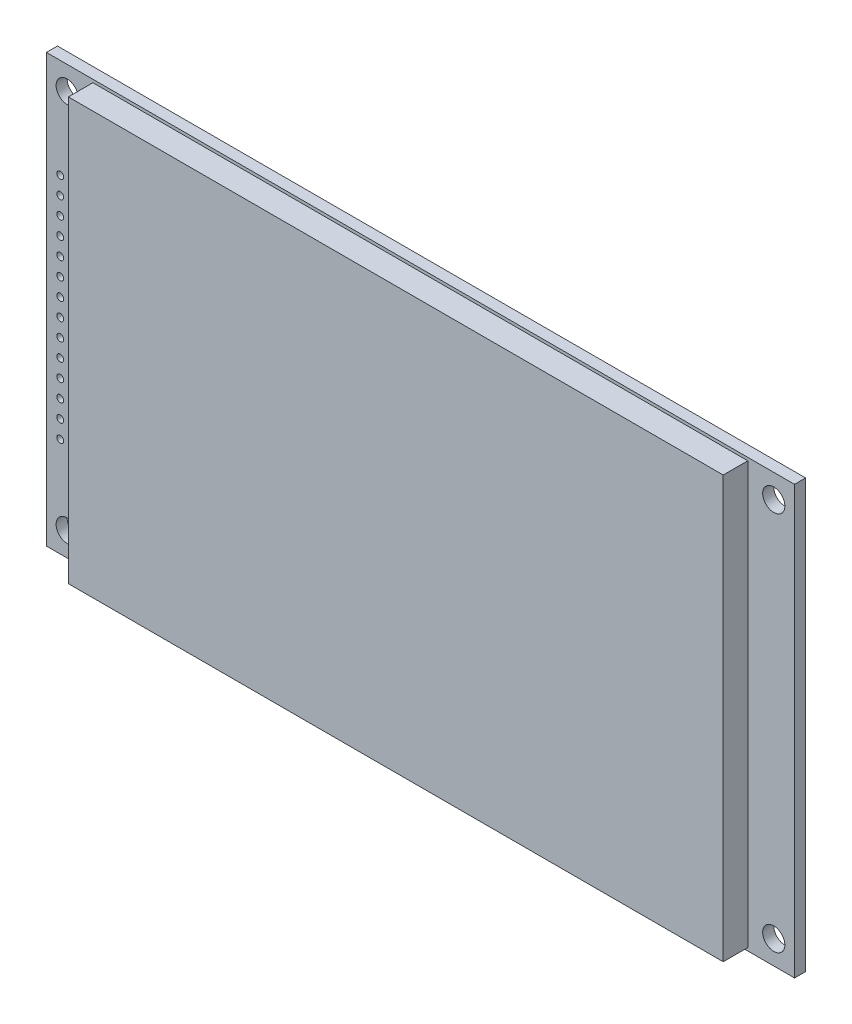
ISO-10303-21;
HEADER;
FILE_DESCRIPTION(('STEP AP214'),'2;1');
FILE_NAME('part.step','',(''),(''),'','','');
FILE_SCHEMA(('AUTOMOTIVE_DESIGN { 1 0 10303 214 1 1 1 1 }'));
ENDSEC;
DATA;
#1=APPLICATION_CONTEXT('core data for automotive mechanical design processes');
#2=APPLICATION_PROTOCOL_DEFINITION('international standard','automotive_design',2000,#1);
#3=PRODUCT_CONTEXT('',#1,'mechanical');
#4=PRODUCT('Part','Part','',(#3));
#5=PRODUCT_RELATED_PRODUCT_CATEGORY('part','',(#4));
#6=PRODUCT_DEFINITION_FORMATION('','',#4);
#7=PRODUCT_DEFINITION_CONTEXT('part definition',#1,'design');
#8=PRODUCT_DEFINITION('design','',#6,#7);
#9=PRODUCT_DEFINITION_SHAPE('','',#8);
#10=(LENGTH_UNIT() NAMED_UNIT(*) SI_UNIT(.MILLI.,.METRE.));
#11=(NAMED_UNIT(*) PLANE_ANGLE_UNIT() SI_UNIT($,.RADIAN.));
#12=(NAMED_UNIT(*) SI_UNIT($,.STERADIAN.) SOLID_ANGLE_UNIT());
#13=UNCERTAINTY_MEASURE_WITH_UNIT(LENGTH_MEASURE(1.E-05),#10,'distance_accuracy_value','');
#14=(GEOMETRIC_REPRESENTATION_CONTEXT(3) GLOBAL_UNCERTAINTY_ASSIGNED_CONTEXT((#13)) GLOBAL_UNIT_ASSIGNED_CONTEXT((#10,
#11,#12)) REPRESENTATION_CONTEXT('',''));
#15=CARTESIAN_POINT('',(0.,0.,0.));
#16=DIRECTION('',(0.,0.,1.));
#17=DIRECTION('',(1.,0.,0.));
#18=AXIS2_PLACEMENT_3D('',#15,#16,#17);
#19=CARTESIAN_POINT('',(0.,0.,1.6));
#20=DIRECTION('',(0.,0.,1.));
#21=DIRECTION('',(1.,0.,0.));
#22=AXIS2_PLACEMENT_3D('',#19,#20,#21);
#23=PLANE('',#22);
#24=CARTESIAN_POINT('',(-52.0200000000004,16.51,1.6));
#25=DIRECTION('',(0.,0.,1.));
#26=DIRECTION('',(1.,0.,0.));
#27=AXIS2_PLACEMENT_3D('',#24,#25,#26);
#28=CIRCLE('',#27,0.499999999999999);
#29=CARTESIAN_POINT('',(-51.5200000000004,16.51,1.6));
#30=VERTEX_POINT('',#29);
#31=EDGE_CURVE('E218',#30,#30,#28,.T.);
#32=ORIENTED_EDGE('',*,*,#31,.F.);
#33=EDGE_LOOP('',(#32));
#34=FACE_BOUND('',#33,.T.);
#35=CARTESIAN_POINT('',(-52.0200000000004,13.97,1.6));
#36=DIRECTION('',(0.,0.,1.));
#37=DIRECTION('',(1.,0.,0.));
#38=AXIS2_PLACEMENT_3D('',#35,#36,#37);
#39=CIRCLE('',#38,0.499999999999999);
#40=CARTESIAN_POINT('',(-51.5200000000004,13.97,1.6));
#41=VERTEX_POINT('',#40);
#42=EDGE_CURVE('E571',#41,#41,#39,.T.);
#43=ORIENTED_EDGE('',*,*,#42,.F.);
#44=EDGE_LOOP('',(#43));
#45=FACE_BOUND('',#44,.T.);
#46=CARTESIAN_POINT('',(-52.0200000000004,11.43,1.6));
#47=DIRECTION('',(0.,0.,1.));
#48=DIRECTION('',(1.,0.,0.));
#49=AXIS2_PLACEMENT_3D('',#46,#47,#48);
#50=CIRCLE('',#49,0.499999999999999);
#51=CARTESIAN_POINT('',(-51.5200000000004,11.43,1.6));
#52=VERTEX_POINT('',#51);
#53=EDGE_CURVE('E575',#52,#52,#50,.T.);
#54=ORIENTED_EDGE('',*,*,#53,.F.);
#55=EDGE_LOOP('',(#54));
#56=FACE_BOUND('',#55,.T.);
#57=CARTESIAN_POINT('',(-52.0200000000004,8.89,1.6));
#58=DIRECTION('',(0.,0.,1.));
#59=DIRECTION('',(1.,0.,0.));
#60=AXIS2_PLACEMENT_3D('',#57,#58,#59);
#61=CIRCLE('',#60,0.499999999999999);
#62=CARTESIAN_POINT('',(-51.5200000000004,8.89,1.6));
#63=VERTEX_POINT('',#62);
#64=EDGE_CURVE('E581',#63,#63,#61,.T.);
#65=ORIENTED_EDGE('',*,*,#64,.F.);
#66=EDGE_LOOP('',(#65));
#67=FACE_BOUND('',#66,.T.);
#68=CARTESIAN_POINT('',(-52.0200000000004,6.35,1.6));
#69=DIRECTION('',(0.,0.,1.));
#70=DIRECTION('',(1.,0.,0.));
#71=AXIS2_PLACEMENT_3D('',#68,#69,#70);
#72=CIRCLE('',#71,0.499999999999999);
#73=CARTESIAN_POINT('',(-51.5200000000004,6.35,1.6));
#74=VERTEX_POINT('',#73);
#75=EDGE_CURVE('E585',#74,#74,#72,.T.);
#76=ORIENTED_EDGE('',*,*,#75,.F.);
#77=EDGE_LOOP('',(#76));
#78=FACE_BOUND('',#77,.T.);
#79=CARTESIAN_POINT('',(-52.0200000000004,3.81,1.6));
#80=DIRECTION('',(0.,0.,1.));
#81=DIRECTION('',(1.,0.,0.));
#82=AXIS2_PLACEMENT_3D('',#79,#80,#81);
#83=CIRCLE('',#82,0.499999999999999);
#84=CARTESIAN_POINT('',(-51.5200000000004,3.81,1.6));
#85=VERTEX_POINT('',#84);
#86=EDGE_CURVE('E589',#85,#85,#83,.T.);
#87=ORIENTED_EDGE('',*,*,#86,.F.);
#88=EDGE_LOOP('',(#87));
#89=FACE_BOUND('',#88,.T.);
#90=CARTESIAN_POINT('',(-52.0200000000004,1.27,1.6));
#91=DIRECTION('',(0.,0.,1.));
#92=DIRECTION('',(1.,0.,0.));
#93=AXIS2_PLACEMENT_3D('',#90,#91,#92);
#94=CIRCLE('',#93,0.499999999999999);
#95=CARTESIAN_POINT('',(-51.5200000000004,1.27,1.6));
#96=VERTEX_POINT('',#95);
#97=EDGE_CURVE('E593',#96,#96,#94,.T.);
#98=ORIENTED_EDGE('',*,*,#97,.F.);
#99=EDGE_LOOP('',(#98));
#100=FACE_BOUND('',#99,.T.);
#101=CARTESIAN_POINT('',(-52.0200000000004,-1.27,1.6));
#102=DIRECTION('',(0.,0.,1.));
#103=DIRECTION('',(1.,0.,0.));
#104=AXIS2_PLACEMENT_3D('',#101,#102,#103);
#105=CIRCLE('',#104,0.499999999999999);
#106=CARTESIAN_POINT('',(-51.5200000000004,-1.27,1.6));
#107=VERTEX_POINT('',#106);
#108=EDGE_CURVE('E597',#107,#107,#105,.T.);
#109=ORIENTED_EDGE('',*,*,#108,.F.);
#110=EDGE_LOOP('',(#109));
#111=FACE_BOUND('',#110,.T.);
#112=CARTESIAN_POINT('',(-52.0200000000004,-3.81,1.6));
#113=DIRECTION('',(0.,0.,1.));
#114=DIRECTION('',(1.,0.,0.));
#115=AXIS2_PLACEMENT_3D('',#112,#113,#114);
#116=CIRCLE('',#115,0.499999999999999);
#117=CARTESIAN_POINT('',(-51.5200000000004,-3.81,1.6));
#118=VERTEX_POINT('',#117);
#119=EDGE_CURVE('E601',#118,#118,#116,.T.);
#120=ORIENTED_EDGE('',*,*,#119,.F.);
#121=EDGE_LOOP('',(#120));
#122=FACE_BOUND('',#121,.T.);
#123=CARTESIAN_POINT('',(-52.0200000000004,-6.35,1.6));
#124=DIRECTION('',(0.,0.,1.));
#125=DIRECTION('',(1.,0.,0.));
#126=AXIS2_PLACEMENT_3D('',#123,#124,#125);
#127=CIRCLE('',#126,0.499999999999999);
#128=CARTESIAN_POINT('',(-51.5200000000004,-6.35,1.6));
#129=VERTEX_POINT('',#128);
#130=EDGE_CURVE('E605',#129,#129,#127,.T.);
#131=ORIENTED_EDGE('',*,*,#130,.F.);
#132=EDGE_LOOP('',(#131));
#133=FACE_BOUND('',#132,.T.);
#134=CARTESIAN_POINT('',(-52.0200000000004,-8.89000000000001,1.6));
#135=DIRECTION('',(0.,0.,1.));
#136=DIRECTION('',(1.,0.,0.));
#137=AXIS2_PLACEMENT_3D('',#134,#135,#136);
#138=CIRCLE('',#137,0.499999999999999);
#139=CARTESIAN_POINT('',(-51.5200000000004,-8.89000000000001,1.6));
#140=VERTEX_POINT('',#139);
#141=EDGE_CURVE('E609',#140,#140,#138,.T.);
#142=ORIENTED_EDGE('',*,*,#141,.F.);
#143=EDGE_LOOP('',(#142));
#144=FACE_BOUND('',#143,.T.);
#145=CARTESIAN_POINT('',(-52.0200000000004,-11.43,1.6));
#146=DIRECTION('',(0.,0.,1.));
#147=DIRECTION('',(1.,0.,0.));
#148=AXIS2_PLACEMENT_3D('',#145,#146,#147);
#149=CIRCLE('',#148,0.499999999999999);
#150=CARTESIAN_POINT('',(-51.5200000000004,-11.43,1.6));
#151=VERTEX_POINT('',#150);
#152=EDGE_CURVE('E613',#151,#151,#149,.T.);
#153=ORIENTED_EDGE('',*,*,#152,.F.);
#154=EDGE_LOOP('',(#153));
#155=FACE_BOUND('',#154,.T.);
#156=CARTESIAN_POINT('',(-52.0200000000004,-13.97,1.6));
#157=DIRECTION('',(0.,0.,1.));
#158=DIRECTION('',(1.,0.,0.));
#159=AXIS2_PLACEMENT_3D('',#156,#157,#158);
#160=CIRCLE('',#159,0.499999999999999);
#161=CARTESIAN_POINT('',(-51.5200000000004,-13.97,1.6));
#162=VERTEX_POINT('',#161);
#163=EDGE_CURVE('E617',#162,#162,#160,.T.);
#164=ORIENTED_EDGE('',*,*,#163,.F.);
#165=EDGE_LOOP('',(#164));
#166=FACE_BOUND('',#165,.T.);
#167=CARTESIAN_POINT('',(-52.0200000000004,-16.51,1.6));
#168=DIRECTION('',(0.,0.,1.));
#169=DIRECTION('',(1.,0.,0.));
#170=AXIS2_PLACEMENT_3D('',#167,#168,#169);
#171=CIRCLE('',#170,0.499999999999999);
#172=CARTESIAN_POINT('',(-51.5200000000004,-16.51,1.6));
#173=VERTEX_POINT('',#172);
#174=EDGE_CURVE('E621',#173,#173,#171,.T.);
#175=ORIENTED_EDGE('',*,*,#174,.F.);
#176=EDGE_LOOP('',(#175));
#177=FACE_BOUND('',#176,.T.);
#178=DIRECTION('',(0.,1.,0.));
#179=VECTOR('',#178,1.);
#180=CARTESIAN_POINT('',(47.2699999999995,30.44,1.6));
#181=LINE('',#180,#179);
#182=CARTESIAN_POINT('',(47.2699999999995,-30.44,1.6));
#183=VERTEX_POINT('',#182);
#184=CARTESIAN_POINT('',(47.2699999999995,30.44,1.6));
#185=VERTEX_POINT('',#184);
#186=EDGE_CURVE('E65',#183,#185,#181,.T.);
#187=ORIENTED_EDGE('',*,*,#186,.F.);
#188=DIRECTION('',(1.,0.,0.));
#189=VECTOR('',#188,1.);
#190=CARTESIAN_POINT('',(47.2699999999995,-30.44,1.6));
#191=LINE('',#190,#189);
#192=CARTESIAN_POINT('',(-47.3000000000004,-30.44,1.6));
#193=VERTEX_POINT('',#192);
#194=EDGE_CURVE('E69',#193,#183,#191,.T.);
#195=ORIENTED_EDGE('',*,*,#194,.F.);
#196=DIRECTION('',(0.,-1.,0.));
#197=VECTOR('',#196,1.);
#198=CARTESIAN_POINT('',(-47.3000000000004,30.44,1.6));
#199=LINE('',#198,#197);
#200=CARTESIAN_POINT('',(-47.3000000000004,30.44,1.6));
#201=VERTEX_POINT('',#200);
#202=EDGE_CURVE('E274',#201,#193,#199,.T.);
#203=ORIENTED_EDGE('',*,*,#202,.F.);
#204=DIRECTION('',(-1.,0.,0.));
#205=VECTOR('',#204,1.);
#206=CARTESIAN_POINT('',(47.2699999999995,30.44,1.6));
#207=LINE('',#206,#205);
#208=EDGE_CURVE('E271',#185,#201,#207,.T.);
#209=ORIENTED_EDGE('',*,*,#208,.F.);
#210=EDGE_LOOP('',(#187,#195,#203,#209));
#211=FACE_BOUND('',#210,.T.);
#212=CARTESIAN_POINT('',(51.02,-27.45,1.6));
#213=DIRECTION('',(0.,0.,1.));
#214=DIRECTION('',(1.,0.,0.));
#215=AXIS2_PLACEMENT_3D('',#212,#213,#214);
#216=CIRCLE('',#215,1.6);
#217=CARTESIAN_POINT('',(52.62,-27.45,1.6));
#218=VERTEX_POINT('',#217);
#219=EDGE_CURVE('E153',#218,#218,#216,.T.);
#220=ORIENTED_EDGE('',*,*,#219,.F.);
#221=EDGE_LOOP('',(#220));
#222=FACE_BOUND('',#221,.T.);
#223=CARTESIAN_POINT('',(-51.02,27.45,1.6));
#224=DIRECTION('',(0.,0.,1.));
#225=DIRECTION('',(1.,0.,0.));
#226=AXIS2_PLACEMENT_3D('',#223,#224,#225);
#227=CIRCLE('',#226,1.6);
#228=CARTESIAN_POINT('',(-49.42,27.45,1.6));
#229=VERTEX_POINT('',#228);
#230=EDGE_CURVE('E169',#229,#229,#227,.T.);
#231=ORIENTED_EDGE('',*,*,#230,.F.);
#232=EDGE_LOOP('',(#231));
#233=FACE_BOUND('',#232,.T.);
#234=DIRECTION('',(0.,1.,0.));
#235=VECTOR('',#234,1.);
#236=CARTESIAN_POINT('',(54.0199999999995,30.87,1.6));
#237=LINE('',#236,#235);
#238=CARTESIAN_POINT('',(54.0199999999995,-30.87,1.6));
#239=VERTEX_POINT('',#238);
#240=CARTESIAN_POINT('',(54.0199999999995,30.87,1.6));
#241=VERTEX_POINT('',#240);
#242=EDGE_CURVE('E177',#239,#241,#237,.T.);
#243=ORIENTED_EDGE('',*,*,#242,.T.);
#244=DIRECTION('',(-1.,0.,0.));
#245=VECTOR('',#244,1.);
#246=CARTESIAN_POINT('',(-54.0200000000004,30.87,1.6));
#247=LINE('',#246,#245);
#248=CARTESIAN_POINT('',(-54.0200000000004,30.87,1.6));
#249=VERTEX_POINT('',#248);
#250=EDGE_CURVE('E181',#241,#249,#247,.T.);
#251=ORIENTED_EDGE('',*,*,#250,.T.);
#252=DIRECTION('',(0.,-1.,0.));
#253=VECTOR('',#252,1.);
#254=CARTESIAN_POINT('',(-54.0200000000004,30.87,1.6));
#255=LINE('',#254,#253);
#256=CARTESIAN_POINT('',(-54.0200000000004,-30.87,1.6));
#257=VERTEX_POINT('',#256);
#258=EDGE_CURVE('E185',#249,#257,#255,.T.);
#259=ORIENTED_EDGE('',*,*,#258,.T.);
#260=DIRECTION('',(1.,0.,0.));
#261=VECTOR('',#260,1.);
#262=CARTESIAN_POINT('',(-54.0200000000004,-30.87,1.6));
#263=LINE('',#262,#261);
#264=EDGE_CURVE('E188',#257,#239,#263,.T.);
#265=ORIENTED_EDGE('',*,*,#264,.T.);
#266=EDGE_LOOP('',(#243,#251,#259,#265));
#267=FACE_BOUND('',#266,.T.);
#268=CARTESIAN_POINT('',(-51.0199999999996,-27.45,1.6));
#269=DIRECTION('',(0.,0.,1.));
#270=DIRECTION('',(1.,0.,0.));
#271=AXIS2_PLACEMENT_3D('',#268,#269,#270);
#272=CIRCLE('',#271,1.6);
#273=CARTESIAN_POINT('',(-49.4199999999996,-27.45,1.6));
#274=VERTEX_POINT('',#273);
#275=EDGE_CURVE('E161',#274,#274,#272,.T.);
#276=ORIENTED_EDGE('',*,*,#275,.F.);
#277=EDGE_LOOP('',(#276));
#278=FACE_BOUND('',#277,.T.);
#279=CARTESIAN_POINT('',(51.02,27.45,1.6));
#280=DIRECTION('',(0.,0.,1.));
#281=DIRECTION('',(1.,0.,0.));
#282=AXIS2_PLACEMENT_3D('',#279,#280,#281);
#283=CIRCLE('',#282,1.6);
#284=CARTESIAN_POINT('',(52.62,27.45,1.6));
#285=VERTEX_POINT('',#284);
#286=EDGE_CURVE('E143',#285,#285,#283,.T.);
#287=ORIENTED_EDGE('',*,*,#286,.F.);
#288=EDGE_LOOP('',(#287));
#289=FACE_BOUND('',#288,.T.);
#290=ADVANCED_FACE('F47',(#34,#45,#56,#67,#78,#89,#100,#111,#122,#133,#144,#155,#166,#177,#211,
#222,#233,#267,#278,#289),#23,.T.);
#291=CARTESIAN_POINT('',(0.,0.,0.));
#292=DIRECTION('',(0.,0.,1.));
#293=DIRECTION('',(1.,0.,0.));
#294=AXIS2_PLACEMENT_3D('',#291,#292,#293);
#295=PLANE('',#294);
#296=CARTESIAN_POINT('',(-52.0200000000004,16.51,0.));
#297=DIRECTION('',(0.,0.,1.));
#298=DIRECTION('',(1.,0.,0.));
#299=AXIS2_PLACEMENT_3D('',#296,#297,#298);
#300=CIRCLE('',#299,0.499999999999999);
#301=CARTESIAN_POINT('',(-51.5200000000004,16.51,0.));
#302=VERTEX_POINT('',#301);
#303=EDGE_CURVE('E51',#302,#302,#300,.T.);
#304=ORIENTED_EDGE('',*,*,#303,.T.);
#305=EDGE_LOOP('',(#304));
#306=FACE_BOUND('',#305,.T.);
#307=CARTESIAN_POINT('',(-52.0200000000004,13.97,0.));
#308=DIRECTION('',(0.,0.,1.));
#309=DIRECTION('',(1.,0.,0.));
#310=AXIS2_PLACEMENT_3D('',#307,#308,#309);
#311=CIRCLE('',#310,0.499999999999999);
#312=CARTESIAN_POINT('',(-51.5200000000004,13.97,0.));
#313=VERTEX_POINT('',#312);
#314=EDGE_CURVE('E261',#313,#313,#311,.T.);
#315=ORIENTED_EDGE('',*,*,#314,.T.);
#316=EDGE_LOOP('',(#315));
#317=FACE_BOUND('',#316,.T.);
#318=CARTESIAN_POINT('',(-52.0200000000004,11.43,0.));
#319=DIRECTION('',(0.,0.,1.));
#320=DIRECTION('',(1.,0.,0.));
#321=AXIS2_PLACEMENT_3D('',#318,#319,#320);
#322=CIRCLE('',#321,0.499999999999999);
#323=CARTESIAN_POINT('',(-51.5200000000004,11.43,0.));
#324=VERTEX_POINT('',#323);
#325=EDGE_CURVE('E258',#324,#324,#322,.T.);
#326=ORIENTED_EDGE('',*,*,#325,.T.);
#327=EDGE_LOOP('',(#326));
#328=FACE_BOUND('',#327,.T.);
#329=CARTESIAN_POINT('',(-52.0200000000004,8.89,0.));
#330=DIRECTION('',(0.,0.,1.));
#331=DIRECTION('',(1.,0.,0.));
#332=AXIS2_PLACEMENT_3D('',#329,#330,#331);
#333=CIRCLE('',#332,0.499999999999999);
#334=CARTESIAN_POINT('',(-51.5200000000004,8.89,0.));
#335=VERTEX_POINT('',#334);
#336=EDGE_CURVE('E254',#335,#335,#333,.T.);
#337=ORIENTED_EDGE('',*,*,#336,.T.);
#338=EDGE_LOOP('',(#337));
#339=FACE_BOUND('',#338,.T.);
#340=CARTESIAN_POINT('',(-52.0200000000004,6.35,0.));
#341=DIRECTION('',(0.,0.,1.));
#342=DIRECTION('',(1.,0.,0.));
#343=AXIS2_PLACEMENT_3D('',#340,#341,#342);
#344=CIRCLE('',#343,0.499999999999999);
#345=CARTESIAN_POINT('',(-51.5200000000004,6.35,0.));
#346=VERTEX_POINT('',#345);
#347=EDGE_CURVE('E250',#346,#346,#344,.T.);
#348=ORIENTED_EDGE('',*,*,#347,.T.);
#349=EDGE_LOOP('',(#348));
#350=FACE_BOUND('',#349,.T.);
#351=CARTESIAN_POINT('',(-52.0200000000004,3.81,0.));
#352=DIRECTION('',(0.,0.,1.));
#353=DIRECTION('',(1.,0.,0.));
#354=AXIS2_PLACEMENT_3D('',#351,#352,#353);
#355=CIRCLE('',#354,0.499999999999999);
#356=CARTESIAN_POINT('',(-51.5200000000004,3.81,0.));
#357=VERTEX_POINT('',#356);
#358=EDGE_CURVE('E246',#357,#357,#355,.T.);
#359=ORIENTED_EDGE('',*,*,#358,.T.);
#360=EDGE_LOOP('',(#359));
#361=FACE_BOUND('',#360,.T.);
#362=CARTESIAN_POINT('',(-52.0200000000004,1.27,0.));
#363=DIRECTION('',(0.,0.,1.));
#364=DIRECTION('',(1.,0.,0.));
#365=AXIS2_PLACEMENT_3D('',#362,#363,#364);
#366=CIRCLE('',#365,0.499999999999999);
#367=CARTESIAN_POINT('',(-51.5200000000004,1.27,0.));
#368=VERTEX_POINT('',#367);
#369=EDGE_CURVE('E242',#368,#368,#366,.T.);
#370=ORIENTED_EDGE('',*,*,#369,.T.);
#371=EDGE_LOOP('',(#370));
#372=FACE_BOUND('',#371,.T.);
#373=CARTESIAN_POINT('',(-52.0200000000004,-1.27,0.));
#374=DIRECTION('',(0.,0.,1.));
#375=DIRECTION('',(1.,0.,0.));
#376=AXIS2_PLACEMENT_3D('',#373,#374,#375);
#377=CIRCLE('',#376,0.499999999999999);
#378=CARTESIAN_POINT('',(-51.5200000000004,-1.27,0.));
#379=VERTEX_POINT('',#378);
#380=EDGE_CURVE('E238',#379,#379,#377,.T.);
#381=ORIENTED_EDGE('',*,*,#380,.T.);
#382=EDGE_LOOP('',(#381));
#383=FACE_BOUND('',#382,.T.);
#384=CARTESIAN_POINT('',(-52.0200000000004,-3.81,0.));
#385=DIRECTION('',(0.,0.,1.));
#386=DIRECTION('',(1.,0.,0.));
#387=AXIS2_PLACEMENT_3D('',#384,#385,#386);
#388=CIRCLE('',#387,0.499999999999999);
#389=CARTESIAN_POINT('',(-51.5200000000004,-3.81,0.));
#390=VERTEX_POINT('',#389);
#391=EDGE_CURVE('E234',#390,#390,#388,.T.);
#392=ORIENTED_EDGE('',*,*,#391,.T.);
#393=EDGE_LOOP('',(#392));
#394=FACE_BOUND('',#393,.T.);
#395=CARTESIAN_POINT('',(-52.0200000000004,-6.35,0.));
#396=DIRECTION('',(0.,0.,1.));
#397=DIRECTION('',(1.,0.,0.));
#398=AXIS2_PLACEMENT_3D('',#395,#396,#397);
#399=CIRCLE('',#398,0.499999999999999);
#400=CARTESIAN_POINT('',(-51.5200000000004,-6.35,0.));
#401=VERTEX_POINT('',#400);
#402=EDGE_CURVE('E230',#401,#401,#399,.T.);
#403=ORIENTED_EDGE('',*,*,#402,.T.);
#404=EDGE_LOOP('',(#403));
#405=FACE_BOUND('',#404,.T.);
#406=CARTESIAN_POINT('',(-52.0200000000004,-8.89000000000001,0.));
#407=DIRECTION('',(0.,0.,1.));
#408=DIRECTION('',(1.,0.,0.));
#409=AXIS2_PLACEMENT_3D('',#406,#407,#408);
#410=CIRCLE('',#409,0.499999999999999);
#411=CARTESIAN_POINT('',(-51.5200000000004,-8.89000000000001,0.));
#412=VERTEX_POINT('',#411);
#413=EDGE_CURVE('E226',#412,#412,#410,.T.);
#414=ORIENTED_EDGE('',*,*,#413,.T.);
#415=EDGE_LOOP('',(#414));
#416=FACE_BOUND('',#415,.T.);
#417=CARTESIAN_POINT('',(-52.0200000000004,-11.43,0.));
#418=DIRECTION('',(0.,0.,1.));
#419=DIRECTION('',(1.,0.,0.));
#420=AXIS2_PLACEMENT_3D('',#417,#418,#419);
#421=CIRCLE('',#420,0.499999999999999);
#422=CARTESIAN_POINT('',(-51.5200000000004,-11.43,0.));
#423=VERTEX_POINT('',#422);
#424=EDGE_CURVE('E222',#423,#423,#421,.T.);
#425=ORIENTED_EDGE('',*,*,#424,.T.);
#426=EDGE_LOOP('',(#425));
#427=FACE_BOUND('',#426,.T.);
#428=CARTESIAN_POINT('',(-52.0200000000004,-13.97,0.));
#429=DIRECTION('',(0.,0.,1.));
#430=DIRECTION('',(1.,0.,0.));
#431=AXIS2_PLACEMENT_3D('',#428,#429,#430);
#432=CIRCLE('',#431,0.499999999999999);
#433=CARTESIAN_POINT('',(-51.5200000000004,-13.97,0.));
#434=VERTEX_POINT('',#433);
#435=EDGE_CURVE('E217',#434,#434,#432,.T.);
#436=ORIENTED_EDGE('',*,*,#435,.T.);
#437=EDGE_LOOP('',(#436));
#438=FACE_BOUND('',#437,.T.);
#439=CARTESIAN_POINT('',(-52.0200000000004,-16.51,0.));
#440=DIRECTION('',(0.,0.,1.));
#441=DIRECTION('',(1.,0.,0.));
#442=AXIS2_PLACEMENT_3D('',#439,#440,#441);
#443=CIRCLE('',#442,0.499999999999999);
#444=CARTESIAN_POINT('',(-51.5200000000004,-16.51,0.));
#445=VERTEX_POINT('',#444);
#446=EDGE_CURVE('E213',#445,#445,#443,.T.);
#447=ORIENTED_EDGE('',*,*,#446,.T.);
#448=EDGE_LOOP('',(#447));
#449=FACE_BOUND('',#448,.T.);
#450=DIRECTION('',(0.,1.,0.));
#451=VECTOR('',#450,1.);
#452=CARTESIAN_POINT('',(54.0199999999995,30.87,0.));
#453=LINE('',#452,#451);
#454=CARTESIAN_POINT('',(54.0199999999995,-30.87,0.));
#455=VERTEX_POINT('',#454);
#456=CARTESIAN_POINT('',(54.0199999999995,30.87,0.));
#457=VERTEX_POINT('',#456);
#458=EDGE_CURVE('E173',#455,#457,#453,.T.);
#459=ORIENTED_EDGE('',*,*,#458,.F.);
#460=DIRECTION('',(1.,0.,0.));
#461=VECTOR('',#460,1.);
#462=CARTESIAN_POINT('',(-54.0200000000004,-30.87,0.));
#463=LINE('',#462,#461);
#464=CARTESIAN_POINT('',(-54.0200000000004,-30.87,0.));
#465=VERTEX_POINT('',#464);
#466=EDGE_CURVE('E182',#465,#455,#463,.T.);
#467=ORIENTED_EDGE('',*,*,#466,.F.);
#468=DIRECTION('',(0.,-1.,0.));
#469=VECTOR('',#468,1.);
#470=CARTESIAN_POINT('',(-54.0200000000004,30.87,0.));
#471=LINE('',#470,#469);
#472=CARTESIAN_POINT('',(-54.0200000000004,30.87,0.));
#473=VERTEX_POINT('',#472);
#474=EDGE_CURVE('E198',#473,#465,#471,.T.);
#475=ORIENTED_EDGE('',*,*,#474,.F.);
#476=DIRECTION('',(-1.,0.,0.));
#477=VECTOR('',#476,1.);
#478=CARTESIAN_POINT('',(-54.0200000000004,30.87,0.));
#479=LINE('',#478,#477);
#480=EDGE_CURVE('E195',#457,#473,#479,.T.);
#481=ORIENTED_EDGE('',*,*,#480,.F.);
#482=EDGE_LOOP('',(#459,#467,#475,#481));
#483=FACE_BOUND('',#482,.T.);
#484=CARTESIAN_POINT('',(-51.02,27.45,0.));
#485=DIRECTION('',(0.,0.,1.));
#486=DIRECTION('',(1.,0.,0.));
#487=AXIS2_PLACEMENT_3D('',#484,#485,#486);
#488=CIRCLE('',#487,1.6);
#489=CARTESIAN_POINT('',(-49.42,27.45,0.));
#490=VERTEX_POINT('',#489);
#491=EDGE_CURVE('E165',#490,#490,#488,.T.);
#492=ORIENTED_EDGE('',*,*,#491,.T.);
#493=EDGE_LOOP('',(#492));
#494=FACE_BOUND('',#493,.T.);
#495=CARTESIAN_POINT('',(-51.0199999999996,-27.45,0.));
#496=DIRECTION('',(0.,0.,1.));
#497=DIRECTION('',(1.,0.,0.));
#498=AXIS2_PLACEMENT_3D('',#495,#496,#497);
#499=CIRCLE('',#498,1.6);
#500=CARTESIAN_POINT('',(-49.4199999999996,-27.45,0.));
#501=VERTEX_POINT('',#500);
#502=EDGE_CURVE('E157',#501,#501,#499,.T.);
#503=ORIENTED_EDGE('',*,*,#502,.T.);
#504=EDGE_LOOP('',(#503));
#505=FACE_BOUND('',#504,.T.);
#506=CARTESIAN_POINT('',(51.02,-27.45,0.));
#507=DIRECTION('',(0.,0.,1.));
#508=DIRECTION('',(1.,0.,0.));
#509=AXIS2_PLACEMENT_3D('',#506,#507,#508);
#510=CIRCLE('',#509,1.6);
#511=CARTESIAN_POINT('',(52.62,-27.45,0.));
#512=VERTEX_POINT('',#511);
#513=EDGE_CURVE('E151',#512,#512,#510,.T.);
#514=ORIENTED_EDGE('',*,*,#513,.T.);
#515=EDGE_LOOP('',(#514));
#516=FACE_BOUND('',#515,.T.);
#517=CARTESIAN_POINT('',(51.02,27.45,0.));
#518=DIRECTION('',(0.,0.,1.));
#519=DIRECTION('',(1.,0.,0.));
#520=AXIS2_PLACEMENT_3D('',#517,#518,#519);
#521=CIRCLE('',#520,1.6);
#522=CARTESIAN_POINT('',(52.62,27.45,0.));
#523=VERTEX_POINT('',#522);
#524=EDGE_CURVE('E138',#523,#523,#521,.T.);
#525=ORIENTED_EDGE('',*,*,#524,.T.);
#526=EDGE_LOOP('',(#525));
#527=FACE_BOUND('',#526,.T.);
#528=ADVANCED_FACE('F294',(#306,#317,#328,#339,#350,#361,#372,#383,#394,#405,#416,#427,#438,
#449,#483,#494,#505,#516,#527),#295,.F.);
#529=CARTESIAN_POINT('',(54.0199999999995,30.87,1.6));
#530=DIRECTION('',(-1.,0.,0.));
#531=DIRECTION('',(0.,0.,1.));
#532=AXIS2_PLACEMENT_3D('',#529,#530,#531);
#533=PLANE('',#532);
#534=ORIENTED_EDGE('',*,*,#458,.T.);
#535=DIRECTION('',(0.,0.,-1.));
#536=VECTOR('',#535,1.);
#537=CARTESIAN_POINT('',(54.0199999999995,30.87,1.6));
#538=LINE('',#537,#536);
#539=EDGE_CURVE('E11',#241,#457,#538,.T.);
#540=ORIENTED_EDGE('',*,*,#539,.F.);
#541=ORIENTED_EDGE('',*,*,#242,.F.);
#542=DIRECTION('',(0.,0.,-1.));
#543=VECTOR('',#542,1.);
#544=CARTESIAN_POINT('',(54.0199999999995,-30.87,1.6));
#545=LINE('',#544,#543);
#546=EDGE_CURVE('E191',#239,#455,#545,.T.);
#547=ORIENTED_EDGE('',*,*,#546,.T.);
#548=EDGE_LOOP('',(#534,#540,#541,#547));
#549=FACE_BOUND('',#548,.T.);
#550=ADVANCED_FACE('F49',(#549),#533,.F.);
#551=CARTESIAN_POINT('',(-54.0200000000004,30.87,1.6));
#552=DIRECTION('',(0.,-1.,0.));
#553=DIRECTION('',(0.,0.,-1.));
#554=AXIS2_PLACEMENT_3D('',#551,#552,#553);
#555=PLANE('',#554);
#556=ORIENTED_EDGE('',*,*,#480,.T.);
#557=DIRECTION('',(0.,0.,-1.));
#558=VECTOR('',#557,1.);
#559=CARTESIAN_POINT('',(-54.0200000000004,30.87,1.6));
#560=LINE('',#559,#558);
#561=EDGE_CURVE('E57',#249,#473,#560,.T.);
#562=ORIENTED_EDGE('',*,*,#561,.F.);
#563=ORIENTED_EDGE('',*,*,#250,.F.);
#564=ORIENTED_EDGE('',*,*,#539,.T.);
#565=EDGE_LOOP('',(#556,#562,#563,#564));
#566=FACE_BOUND('',#565,.T.);
#567=ADVANCED_FACE('F320',(#566),#555,.F.);
#568=CARTESIAN_POINT('',(-54.0200000000004,30.87,1.6));
#569=DIRECTION('',(1.,0.,0.));
#570=DIRECTION('',(0.,0.,-1.));
#571=AXIS2_PLACEMENT_3D('',#568,#569,#570);
#572=PLANE('',#571);
#573=ORIENTED_EDGE('',*,*,#474,.T.);
#574=DIRECTION('',(0.,0.,-1.));
#575=VECTOR('',#574,1.);
#576=CARTESIAN_POINT('',(-54.0200000000004,-30.87,1.6));
#577=LINE('',#576,#575);
#578=EDGE_CURVE('E206',#257,#465,#577,.T.);
#579=ORIENTED_EDGE('',*,*,#578,.F.);
#580=ORIENTED_EDGE('',*,*,#258,.F.);
#581=ORIENTED_EDGE('',*,*,#561,.T.);
#582=EDGE_LOOP('',(#573,#579,#580,#581));
#583=FACE_BOUND('',#582,.T.);
#584=ADVANCED_FACE('F328',(#583),#572,.F.);
#585=CARTESIAN_POINT('',(-54.0200000000004,-30.87,1.6));
#586=DIRECTION('',(0.,1.,0.));
#587=DIRECTION('',(0.,0.,1.));
#588=AXIS2_PLACEMENT_3D('',#585,#586,#587);
#589=PLANE('',#588);
#590=ORIENTED_EDGE('',*,*,#466,.T.);
#591=ORIENTED_EDGE('',*,*,#546,.F.);
#592=ORIENTED_EDGE('',*,*,#264,.F.);
#593=ORIENTED_EDGE('',*,*,#578,.T.);
#594=EDGE_LOOP('',(#590,#591,#592,#593));
#595=FACE_BOUND('',#594,.T.);
#596=ADVANCED_FACE('F324',(#595),#589,.F.);
#597=CARTESIAN_POINT('',(-51.02,27.45,1.6));
#598=DIRECTION('',(0.,0.,-1.));
#599=DIRECTION('',(-1.,0.,0.));
#600=AXIS2_PLACEMENT_3D('',#597,#598,#599);
#601=CYLINDRICAL_SURFACE('',#600,1.6);
#602=ORIENTED_EDGE('',*,*,#230,.T.);
#603=EDGE_LOOP('',(#602));
#604=FACE_BOUND('',#603,.T.);
#605=ORIENTED_EDGE('',*,*,#491,.F.);
#606=EDGE_LOOP('',(#605));
#607=FACE_BOUND('',#606,.T.);
#608=ADVANCED_FACE('F327',(#604,#607),#601,.F.);
#609=CARTESIAN_POINT('',(-51.0199999999996,-27.45,1.6));
#610=DIRECTION('',(0.,0.,-1.));
#611=DIRECTION('',(-1.,0.,0.));
#612=AXIS2_PLACEMENT_3D('',#609,#610,#611);
#613=CYLINDRICAL_SURFACE('',#612,1.6);
#614=ORIENTED_EDGE('',*,*,#275,.T.);
#615=EDGE_LOOP('',(#614));
#616=FACE_BOUND('',#615,.T.);
#617=ORIENTED_EDGE('',*,*,#502,.F.);
#618=EDGE_LOOP('',(#617));
#619=FACE_BOUND('',#618,.T.);
#620=ADVANCED_FACE('F353',(#616,#619),#613,.F.);
#621=CARTESIAN_POINT('',(51.02,-27.45,1.6));
#622=DIRECTION('',(0.,0.,-1.));
#623=DIRECTION('',(-1.,0.,0.));
#624=AXIS2_PLACEMENT_3D('',#621,#622,#623);
#625=CYLINDRICAL_SURFACE('',#624,1.6);
#626=ORIENTED_EDGE('',*,*,#219,.T.);
#627=EDGE_LOOP('',(#626));
#628=FACE_BOUND('',#627,.T.);
#629=ORIENTED_EDGE('',*,*,#513,.F.);
#630=EDGE_LOOP('',(#629));
#631=FACE_BOUND('',#630,.T.);
#632=ADVANCED_FACE('F311',(#628,#631),#625,.F.);
#633=CARTESIAN_POINT('',(51.02,27.45,1.6));
#634=DIRECTION('',(0.,0.,-1.));
#635=DIRECTION('',(-1.,0.,0.));
#636=AXIS2_PLACEMENT_3D('',#633,#634,#635);
#637=CYLINDRICAL_SURFACE('',#636,1.6);
#638=ORIENTED_EDGE('',*,*,#286,.T.);
#639=EDGE_LOOP('',(#638));
#640=FACE_BOUND('',#639,.T.);
#641=ORIENTED_EDGE('',*,*,#524,.F.);
#642=EDGE_LOOP('',(#641));
#643=FACE_BOUND('',#642,.T.);
#644=ADVANCED_FACE('F308',(#640,#643),#637,.F.);
#645=CARTESIAN_POINT('',(47.2699999999995,30.44,5.15));
#646=DIRECTION('',(-1.,0.,0.));
#647=DIRECTION('',(0.,0.,1.));
#648=AXIS2_PLACEMENT_3D('',#645,#646,#647);
#649=PLANE('',#648);
#650=ORIENTED_EDGE('',*,*,#186,.T.);
#651=DIRECTION('',(0.,0.,-1.));
#652=VECTOR('',#651,1.);
#653=CARTESIAN_POINT('',(47.2699999999995,30.44,5.15));
#654=LINE('',#653,#652);
#655=CARTESIAN_POINT('',(47.2699999999995,30.44,5.15));
#656=VERTEX_POINT('',#655);
#657=EDGE_CURVE('E118',#656,#185,#654,.T.);
#658=ORIENTED_EDGE('',*,*,#657,.F.);
#659=DIRECTION('',(0.,1.,0.));
#660=VECTOR('',#659,1.);
#661=CARTESIAN_POINT('',(47.2699999999995,30.44,5.15));
#662=LINE('',#661,#660);
#663=CARTESIAN_POINT('',(47.2699999999995,-30.44,5.15));
#664=VERTEX_POINT('',#663);
#665=EDGE_CURVE('E125',#664,#656,#662,.T.);
#666=ORIENTED_EDGE('',*,*,#665,.F.);
#667=DIRECTION('',(0.,0.,-1.));
#668=VECTOR('',#667,1.);
#669=CARTESIAN_POINT('',(47.2699999999995,-30.44,5.15));
#670=LINE('',#669,#668);
#671=EDGE_CURVE('E283',#664,#183,#670,.T.);
#672=ORIENTED_EDGE('',*,*,#671,.T.);
#673=EDGE_LOOP('',(#650,#658,#666,#672));
#674=FACE_BOUND('',#673,.T.);
#675=ADVANCED_FACE('F136',(#674),#649,.F.);
#676=CARTESIAN_POINT('',(47.2699999999995,30.44,5.15));
#677=DIRECTION('',(0.,-1.,0.));
#678=DIRECTION('',(1.,0.,0.));
#679=AXIS2_PLACEMENT_3D('',#676,#677,#678);
#680=PLANE('',#679);
#681=ORIENTED_EDGE('',*,*,#208,.T.);
#682=DIRECTION('',(0.,0.,-1.));
#683=VECTOR('',#682,1.);
#684=CARTESIAN_POINT('',(-47.3000000000004,30.44,5.15));
#685=LINE('',#684,#683);
#686=CARTESIAN_POINT('',(-47.3000000000004,30.44,5.15));
#687=VERTEX_POINT('',#686);
#688=EDGE_CURVE('E120',#687,#201,#685,.T.);
#689=ORIENTED_EDGE('',*,*,#688,.F.);
#690=DIRECTION('',(-1.,0.,0.));
#691=VECTOR('',#690,1.);
#692=CARTESIAN_POINT('',(47.2699999999995,30.44,5.15));
#693=LINE('',#692,#691);
#694=EDGE_CURVE('E113',#656,#687,#693,.T.);
#695=ORIENTED_EDGE('',*,*,#694,.F.);
#696=ORIENTED_EDGE('',*,*,#657,.T.);
#697=EDGE_LOOP('',(#681,#689,#695,#696));
#698=FACE_BOUND('',#697,.T.);
#699=ADVANCED_FACE('F116',(#698),#680,.F.);
#700=CARTESIAN_POINT('',(-47.3000000000004,30.44,5.15));
#701=DIRECTION('',(1.,0.,0.));
#702=DIRECTION('',(0.,0.,-1.));
#703=AXIS2_PLACEMENT_3D('',#700,#701,#702);
#704=PLANE('',#703);
#705=ORIENTED_EDGE('',*,*,#202,.T.);
#706=DIRECTION('',(0.,0.,-1.));
#707=VECTOR('',#706,1.);
#708=CARTESIAN_POINT('',(-47.3000000000004,-30.44,5.15));
#709=LINE('',#708,#707);
#710=CARTESIAN_POINT('',(-47.3000000000004,-30.44,5.15));
#711=VERTEX_POINT('',#710);
#712=EDGE_CURVE('E145',#711,#193,#709,.T.);
#713=ORIENTED_EDGE('',*,*,#712,.F.);
#714=DIRECTION('',(0.,-1.,0.));
#715=VECTOR('',#714,1.);
#716=CARTESIAN_POINT('',(-47.3000000000004,30.44,5.15));
#717=LINE('',#716,#715);
#718=EDGE_CURVE('E124',#687,#711,#717,.T.);
#719=ORIENTED_EDGE('',*,*,#718,.F.);
#720=ORIENTED_EDGE('',*,*,#688,.T.);
#721=EDGE_LOOP('',(#705,#713,#719,#720));
#722=FACE_BOUND('',#721,.T.);
#723=ADVANCED_FACE('F291',(#722),#704,.F.);
#724=CARTESIAN_POINT('',(47.2699999999995,-30.44,5.15));
#725=DIRECTION('',(0.,1.,0.));
#726=DIRECTION('',(-1.,0.,0.));
#727=AXIS2_PLACEMENT_3D('',#724,#725,#726);
#728=PLANE('',#727);
#729=ORIENTED_EDGE('',*,*,#194,.T.);
#730=ORIENTED_EDGE('',*,*,#671,.F.);
#731=DIRECTION('',(1.,0.,0.));
#732=VECTOR('',#731,1.);
#733=CARTESIAN_POINT('',(47.2699999999995,-30.44,5.15));
#734=LINE('',#733,#732);
#735=EDGE_CURVE('E130',#711,#664,#734,.T.);
#736=ORIENTED_EDGE('',*,*,#735,.F.);
#737=ORIENTED_EDGE('',*,*,#712,.T.);
#738=EDGE_LOOP('',(#729,#730,#736,#737));
#739=FACE_BOUND('',#738,.T.);
#740=ADVANCED_FACE('F289',(#739),#728,.F.);
#741=CARTESIAN_POINT('',(0.,0.,5.15));
#742=DIRECTION('',(0.,0.,-1.));
#743=DIRECTION('',(-1.,0.,0.));
#744=AXIS2_PLACEMENT_3D('',#741,#742,#743);
#745=PLANE('',#744);
#746=ORIENTED_EDGE('',*,*,#665,.T.);
#747=ORIENTED_EDGE('',*,*,#694,.T.);
#748=ORIENTED_EDGE('',*,*,#718,.T.);
#749=ORIENTED_EDGE('',*,*,#735,.T.);
#750=EDGE_LOOP('',(#746,#747,#748,#749));
#751=FACE_BOUND('',#750,.T.);
#752=ADVANCED_FACE('F128',(#751),#745,.F.);
#753=CARTESIAN_POINT('',(-52.0200000000004,-16.51,-1.95));
#754=DIRECTION('',(0.,0.,1.));
#755=DIRECTION('',(1.,0.,0.));
#756=AXIS2_PLACEMENT_3D('',#753,#754,#755);
#757=CYLINDRICAL_SURFACE('',#756,0.499999999999999);
#758=ORIENTED_EDGE('',*,*,#174,.T.);
#759=EDGE_LOOP('',(#758));
#760=FACE_BOUND('',#759,.T.);
#761=ORIENTED_EDGE('',*,*,#446,.F.);
#762=EDGE_LOOP('',(#761));
#763=FACE_BOUND('',#762,.T.);
#764=ADVANCED_FACE('F425',(#760,#763),#757,.F.);
#765=CARTESIAN_POINT('',(-52.0200000000004,-13.97,-1.95));
#766=DIRECTION('',(0.,0.,1.));
#767=DIRECTION('',(1.,0.,0.));
#768=AXIS2_PLACEMENT_3D('',#765,#766,#767);
#769=CYLINDRICAL_SURFACE('',#768,0.499999999999999);
#770=ORIENTED_EDGE('',*,*,#163,.T.);
#771=EDGE_LOOP('',(#770));
#772=FACE_BOUND('',#771,.T.);
#773=ORIENTED_EDGE('',*,*,#435,.F.);
#774=EDGE_LOOP('',(#773));
#775=FACE_BOUND('',#774,.T.);
#776=ADVANCED_FACE('F434',(#772,#775),#769,.F.);
#777=CARTESIAN_POINT('',(-52.0200000000004,-11.43,-1.95));
#778=DIRECTION('',(0.,0.,1.));
#779=DIRECTION('',(1.,0.,0.));
#780=AXIS2_PLACEMENT_3D('',#777,#778,#779);
#781=CYLINDRICAL_SURFACE('',#780,0.499999999999999);
#782=ORIENTED_EDGE('',*,*,#152,.T.);
#783=EDGE_LOOP('',(#782));
#784=FACE_BOUND('',#783,.T.);
#785=ORIENTED_EDGE('',*,*,#424,.F.);
#786=EDGE_LOOP('',(#785));
#787=FACE_BOUND('',#786,.T.);
#788=ADVANCED_FACE('F444',(#784,#787),#781,.F.);
#789=CARTESIAN_POINT('',(-52.0200000000004,-8.89000000000001,-1.95));
#790=DIRECTION('',(0.,0.,1.));
#791=DIRECTION('',(1.,0.,0.));
#792=AXIS2_PLACEMENT_3D('',#789,#790,#791);
#793=CYLINDRICAL_SURFACE('',#792,0.499999999999999);
#794=ORIENTED_EDGE('',*,*,#141,.T.);
#795=EDGE_LOOP('',(#794));
#796=FACE_BOUND('',#795,.T.);
#797=ORIENTED_EDGE('',*,*,#413,.F.);
#798=EDGE_LOOP('',(#797));
#799=FACE_BOUND('',#798,.T.);
#800=ADVANCED_FACE('F454',(#796,#799),#793,.F.);
#801=CARTESIAN_POINT('',(-52.0200000000004,-6.35,-1.95));
#802=DIRECTION('',(0.,0.,1.));
#803=DIRECTION('',(1.,0.,0.));
#804=AXIS2_PLACEMENT_3D('',#801,#802,#803);
#805=CYLINDRICAL_SURFACE('',#804,0.499999999999999);
#806=ORIENTED_EDGE('',*,*,#130,.T.);
#807=EDGE_LOOP('',(#806));
#808=FACE_BOUND('',#807,.T.);
#809=ORIENTED_EDGE('',*,*,#402,.F.);
#810=EDGE_LOOP('',(#809));
#811=FACE_BOUND('',#810,.T.);
#812=ADVANCED_FACE('F464',(#808,#811),#805,.F.);
#813=CARTESIAN_POINT('',(-52.0200000000004,-3.81,-1.95));
#814=DIRECTION('',(0.,0.,1.));
#815=DIRECTION('',(1.,0.,0.));
#816=AXIS2_PLACEMENT_3D('',#813,#814,#815);
#817=CYLINDRICAL_SURFACE('',#816,0.499999999999999);
#818=ORIENTED_EDGE('',*,*,#119,.T.);
#819=EDGE_LOOP('',(#818));
#820=FACE_BOUND('',#819,.T.);
#821=ORIENTED_EDGE('',*,*,#391,.F.);
#822=EDGE_LOOP('',(#821));
#823=FACE_BOUND('',#822,.T.);
#824=ADVANCED_FACE('F474',(#820,#823),#817,.F.);
#825=CARTESIAN_POINT('',(-52.0200000000004,-1.27,-1.95));
#826=DIRECTION('',(0.,0.,1.));
#827=DIRECTION('',(1.,0.,0.));
#828=AXIS2_PLACEMENT_3D('',#825,#826,#827);
#829=CYLINDRICAL_SURFACE('',#828,0.499999999999999);
#830=ORIENTED_EDGE('',*,*,#108,.T.);
#831=EDGE_LOOP('',(#830));
#832=FACE_BOUND('',#831,.T.);
#833=ORIENTED_EDGE('',*,*,#380,.F.);
#834=EDGE_LOOP('',(#833));
#835=FACE_BOUND('',#834,.T.);
#836=ADVANCED_FACE('F484',(#832,#835),#829,.F.);
#837=CARTESIAN_POINT('',(-52.0200000000004,1.27,-1.95));
#838=DIRECTION('',(0.,0.,1.));
#839=DIRECTION('',(1.,0.,0.));
#840=AXIS2_PLACEMENT_3D('',#837,#838,#839);
#841=CYLINDRICAL_SURFACE('',#840,0.499999999999999);
#842=ORIENTED_EDGE('',*,*,#97,.T.);
#843=EDGE_LOOP('',(#842));
#844=FACE_BOUND('',#843,.T.);
#845=ORIENTED_EDGE('',*,*,#369,.F.);
#846=EDGE_LOOP('',(#845));
#847=FACE_BOUND('',#846,.T.);
#848=ADVANCED_FACE('F494',(#844,#847),#841,.F.);
#849=CARTESIAN_POINT('',(-52.0200000000004,3.81,-1.95));
#850=DIRECTION('',(0.,0.,1.));
#851=DIRECTION('',(1.,0.,0.));
#852=AXIS2_PLACEMENT_3D('',#849,#850,#851);
#853=CYLINDRICAL_SURFACE('',#852,0.499999999999999);
#854=ORIENTED_EDGE('',*,*,#86,.T.);
#855=EDGE_LOOP('',(#854));
#856=FACE_BOUND('',#855,.T.);
#857=ORIENTED_EDGE('',*,*,#358,.F.);
#858=EDGE_LOOP('',(#857));
#859=FACE_BOUND('',#858,.T.);
#860=ADVANCED_FACE('F504',(#856,#859),#853,.F.);
#861=CARTESIAN_POINT('',(-52.0200000000004,6.35,-1.95));
#862=DIRECTION('',(0.,0.,1.));
#863=DIRECTION('',(1.,0.,0.));
#864=AXIS2_PLACEMENT_3D('',#861,#862,#863);
#865=CYLINDRICAL_SURFACE('',#864,0.499999999999999);
#866=ORIENTED_EDGE('',*,*,#75,.T.);
#867=EDGE_LOOP('',(#866));
#868=FACE_BOUND('',#867,.T.);
#869=ORIENTED_EDGE('',*,*,#347,.F.);
#870=EDGE_LOOP('',(#869));
#871=FACE_BOUND('',#870,.T.);
#872=ADVANCED_FACE('F514',(#868,#871),#865,.F.);
#873=CARTESIAN_POINT('',(-52.0200000000004,8.89,-1.95));
#874=DIRECTION('',(0.,0.,1.));
#875=DIRECTION('',(1.,0.,0.));
#876=AXIS2_PLACEMENT_3D('',#873,#874,#875);
#877=CYLINDRICAL_SURFACE('',#876,0.499999999999999);
#878=ORIENTED_EDGE('',*,*,#64,.T.);
#879=EDGE_LOOP('',(#878));
#880=FACE_BOUND('',#879,.T.);
#881=ORIENTED_EDGE('',*,*,#336,.F.);
#882=EDGE_LOOP('',(#881));
#883=FACE_BOUND('',#882,.T.);
#884=ADVANCED_FACE('F524',(#880,#883),#877,.F.);
#885=CARTESIAN_POINT('',(-52.0200000000004,11.43,-1.95));
#886=DIRECTION('',(0.,0.,1.));
#887=DIRECTION('',(1.,0.,0.));
#888=AXIS2_PLACEMENT_3D('',#885,#886,#887);
#889=CYLINDRICAL_SURFACE('',#888,0.499999999999999);
#890=ORIENTED_EDGE('',*,*,#53,.T.);
#891=EDGE_LOOP('',(#890));
#892=FACE_BOUND('',#891,.T.);
#893=ORIENTED_EDGE('',*,*,#325,.F.);
#894=EDGE_LOOP('',(#893));
#895=FACE_BOUND('',#894,.T.);
#896=ADVANCED_FACE('F534',(#892,#895),#889,.F.);
#897=CARTESIAN_POINT('',(-52.0200000000004,13.97,-1.95));
#898=DIRECTION('',(0.,0.,1.));
#899=DIRECTION('',(1.,0.,0.));
#900=AXIS2_PLACEMENT_3D('',#897,#898,#899);
#901=CYLINDRICAL_SURFACE('',#900,0.499999999999999);
#902=ORIENTED_EDGE('',*,*,#42,.T.);
#903=EDGE_LOOP('',(#902));
#904=FACE_BOUND('',#903,.T.);
#905=ORIENTED_EDGE('',*,*,#314,.F.);
#906=EDGE_LOOP('',(#905));
#907=FACE_BOUND('',#906,.T.);
#908=ADVANCED_FACE('F544',(#904,#907),#901,.F.);
#909=CARTESIAN_POINT('',(-52.0200000000004,16.51,-1.95));
#910=DIRECTION('',(0.,0.,1.));
#911=DIRECTION('',(1.,0.,0.));
#912=AXIS2_PLACEMENT_3D('',#909,#910,#911);
#913=CYLINDRICAL_SURFACE('',#912,0.499999999999999);
#914=ORIENTED_EDGE('',*,*,#31,.T.);
#915=EDGE_LOOP('',(#914));
#916=FACE_BOUND('',#915,.T.);
#917=ORIENTED_EDGE('',*,*,#303,.F.);
#918=EDGE_LOOP('',(#917));
#919=FACE_BOUND('',#918,.T.);
#920=ADVANCED_FACE('F554',(#916,#919),#913,.F.);
#921=CLOSED_SHELL('',(#290,#528,#550,#567,#584,#596,#608,#620,#632,#644,#675,#699,#723,#740,
#752,#764,#776,#788,#800,#812,#824,#836,#848,#860,#872,#884,#896,#908,#920));
#922=MANIFOLD_SOLID_BREP('B2',#921);
#923=ADVANCED_BREP_SHAPE_REPRESENTATION('',(#18,#922),#14);
#924=SHAPE_DEFINITION_REPRESENTATION(#9,#923);
ENDSEC;
END-ISO-10303-21;
